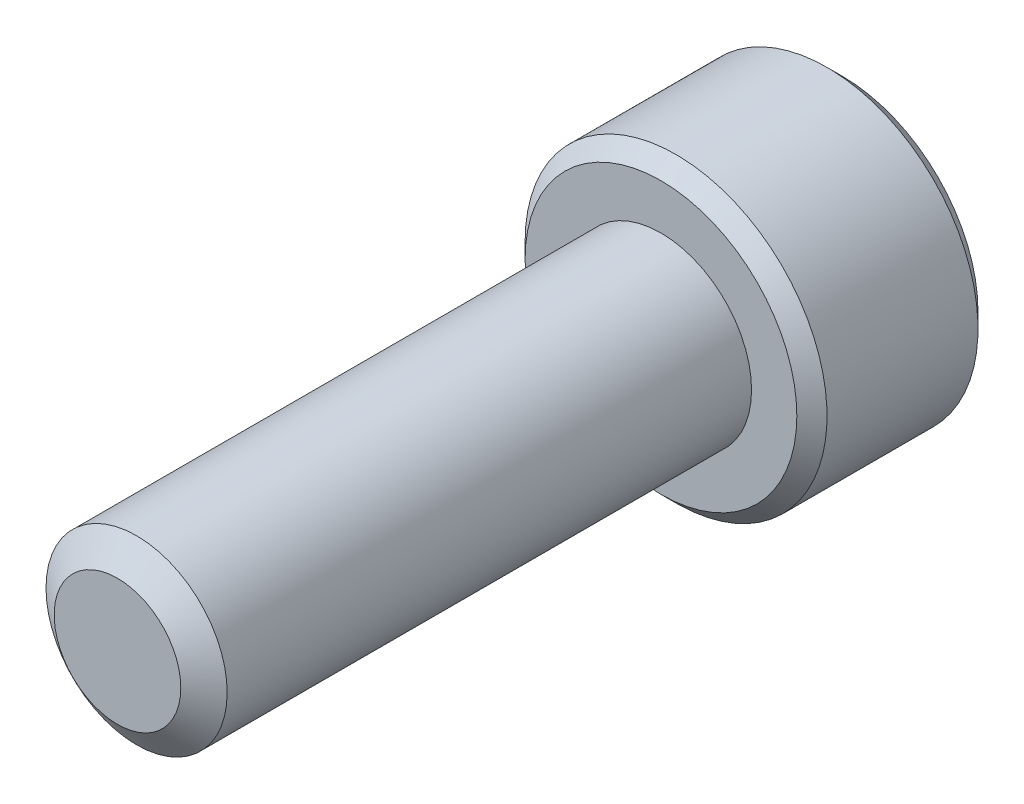
ISO-10303-21;
HEADER;
FILE_DESCRIPTION(('STEP AP214'),'2;1');
FILE_NAME('part.step','',(''),(''),'','','');
FILE_SCHEMA(('AUTOMOTIVE_DESIGN { 1 0 10303 214 1 1 1 1 }'));
ENDSEC;
DATA;
#1=APPLICATION_CONTEXT('core data for automotive mechanical design processes');
#2=APPLICATION_PROTOCOL_DEFINITION('international standard','automotive_design',2000,#1);
#3=PRODUCT_CONTEXT('',#1,'mechanical');
#4=PRODUCT('Part','Part','',(#3));
#5=PRODUCT_RELATED_PRODUCT_CATEGORY('part','',(#4));
#6=PRODUCT_DEFINITION_FORMATION('','',#4);
#7=PRODUCT_DEFINITION_CONTEXT('part definition',#1,'design');
#8=PRODUCT_DEFINITION('design','',#6,#7);
#9=PRODUCT_DEFINITION_SHAPE('','',#8);
#10=(LENGTH_UNIT() NAMED_UNIT(*) SI_UNIT(.MILLI.,.METRE.));
#11=(NAMED_UNIT(*) PLANE_ANGLE_UNIT() SI_UNIT($,.RADIAN.));
#12=(NAMED_UNIT(*) SI_UNIT($,.STERADIAN.) SOLID_ANGLE_UNIT());
#13=UNCERTAINTY_MEASURE_WITH_UNIT(LENGTH_MEASURE(1.E-05),#10,'distance_accuracy_value','');
#14=(GEOMETRIC_REPRESENTATION_CONTEXT(3) GLOBAL_UNCERTAINTY_ASSIGNED_CONTEXT((#13)) GLOBAL_UNIT_ASSIGNED_CONTEXT((#10,
#11,#12)) REPRESENTATION_CONTEXT('',''));
#15=CARTESIAN_POINT('',(0.,0.,0.));
#16=DIRECTION('',(0.,0.,1.));
#17=DIRECTION('',(1.,0.,0.));
#18=AXIS2_PLACEMENT_3D('',#15,#16,#17);
#19=CARTESIAN_POINT('',(0.,0.,-18.));
#20=DIRECTION('',(0.,0.,1.));
#21=DIRECTION('',(1.,0.,0.));
#22=AXIS2_PLACEMENT_3D('',#19,#20,#21);
#23=CYLINDRICAL_SURFACE('',#22,3.);
#24=CARTESIAN_POINT('',(0.,0.,-18.));
#25=DIRECTION('',(0.,0.,-1.));
#26=DIRECTION('',(-1.,0.,0.));
#27=AXIS2_PLACEMENT_3D('',#24,#25,#26);
#28=CIRCLE('',#27,3.);
#29=CARTESIAN_POINT('',(-3.,0.,-18.));
#30=VERTEX_POINT('',#29);
#31=EDGE_CURVE('E154',#30,#30,#28,.F.);
#32=ORIENTED_EDGE('',*,*,#31,.T.);
#33=EDGE_LOOP('',(#32));
#34=FACE_BOUND('',#33,.T.);
#35=CARTESIAN_POINT('',(0.,0.,-0.632650851713494));
#36=DIRECTION('',(0.,0.,1.));
#37=DIRECTION('',(1.,0.,0.));
#38=AXIS2_PLACEMENT_3D('',#35,#36,#37);
#39=CIRCLE('',#38,3.);
#40=CARTESIAN_POINT('',(3.,0.,-0.632650851713494));
#41=VERTEX_POINT('',#40);
#42=EDGE_CURVE('E171',#41,#41,#39,.T.);
#43=ORIENTED_EDGE('',*,*,#42,.F.);
#44=EDGE_LOOP('',(#43));
#45=FACE_BOUND('',#44,.T.);
#46=ADVANCED_FACE('F39',(#34,#45),#23,.T.);
#47=CARTESIAN_POINT('',(0.,0.,0.));
#48=DIRECTION('',(0.,0.,-1.));
#49=DIRECTION('',(-1.,0.,0.));
#50=AXIS2_PLACEMENT_3D('',#47,#48,#49);
#51=CONICAL_SURFACE('',#50,2.09648094716167,0.959931088596884);
#52=ORIENTED_EDGE('',*,*,#42,.T.);
#53=EDGE_LOOP('',(#52));
#54=FACE_BOUND('',#53,.T.);
#55=CARTESIAN_POINT('',(0.,0.,0.));
#56=DIRECTION('',(0.,0.,1.));
#57=DIRECTION('',(1.,0.,0.));
#58=AXIS2_PLACEMENT_3D('',#55,#56,#57);
#59=CIRCLE('',#58,2.09648094716167);
#60=CARTESIAN_POINT('',(2.09648094716167,0.,0.));
#61=VERTEX_POINT('',#60);
#62=EDGE_CURVE('E167',#61,#61,#59,.T.);
#63=ORIENTED_EDGE('',*,*,#62,.F.);
#64=EDGE_LOOP('',(#63));
#65=FACE_BOUND('',#64,.T.);
#66=ADVANCED_FACE('F220',(#54,#65),#51,.T.);
#67=CARTESIAN_POINT('',(0.,0.,0.));
#68=DIRECTION('',(0.,0.,1.));
#69=DIRECTION('',(1.,0.,0.));
#70=AXIS2_PLACEMENT_3D('',#67,#68,#69);
#71=PLANE('',#70);
#72=ORIENTED_EDGE('',*,*,#62,.T.);
#73=EDGE_LOOP('',(#72));
#74=FACE_BOUND('',#73,.T.);
#75=ADVANCED_FACE('F226',(#74),#71,.T.);
#76=CARTESIAN_POINT('',(0.,0.,-24.));
#77=DIRECTION('',(0.,0.,1.));
#78=DIRECTION('',(1.,0.,0.));
#79=AXIS2_PLACEMENT_3D('',#76,#77,#78);
#80=CYLINDRICAL_SURFACE('',#79,5.);
#81=CARTESIAN_POINT('',(0.,0.,-23.5));
#82=DIRECTION('',(0.,0.,-1.));
#83=DIRECTION('',(-1.,0.,0.));
#84=AXIS2_PLACEMENT_3D('',#81,#82,#83);
#85=CIRCLE('',#84,5.);
#86=CARTESIAN_POINT('',(-5.,0.,-23.5));
#87=VERTEX_POINT('',#86);
#88=EDGE_CURVE('E48',#87,#87,#85,.F.);
#89=ORIENTED_EDGE('',*,*,#88,.T.);
#90=EDGE_LOOP('',(#89));
#91=FACE_BOUND('',#90,.T.);
#92=CARTESIAN_POINT('',(0.,0.,-18.5));
#93=DIRECTION('',(0.,0.,-1.));
#94=DIRECTION('',(-1.,0.,0.));
#95=AXIS2_PLACEMENT_3D('',#92,#93,#94);
#96=CIRCLE('',#95,5.);
#97=CARTESIAN_POINT('',(-5.,0.,-18.5));
#98=VERTEX_POINT('',#97);
#99=EDGE_CURVE('E179',#98,#98,#96,.T.);
#100=ORIENTED_EDGE('',*,*,#99,.T.);
#101=EDGE_LOOP('',(#100));
#102=FACE_BOUND('',#101,.T.);
#103=ADVANCED_FACE('F186',(#91,#102),#80,.T.);
#104=CARTESIAN_POINT('',(0.,0.,-24.));
#105=DIRECTION('',(0.,0.,-1.));
#106=DIRECTION('',(-1.,0.,0.));
#107=AXIS2_PLACEMENT_3D('',#104,#105,#106);
#108=PLANE('',#107);
#109=CARTESIAN_POINT('',(0.,0.,-24.));
#110=DIRECTION('',(0.,0.,-1.));
#111=DIRECTION('',(-1.,0.,0.));
#112=AXIS2_PLACEMENT_3D('',#109,#110,#111);
#113=CIRCLE('',#112,4.5);
#114=CARTESIAN_POINT('',(-4.5,0.,-24.));
#115=VERTEX_POINT('',#114);
#116=EDGE_CURVE('E175',#115,#115,#113,.T.);
#117=ORIENTED_EDGE('',*,*,#116,.T.);
#118=EDGE_LOOP('',(#117));
#119=FACE_BOUND('',#118,.T.);
#120=DIRECTION('',(0.866025403784439,0.5,0.));
#121=VECTOR('',#120,1.);
#122=CARTESIAN_POINT('',(-2.5,1.44337567297406,-24.));
#123=LINE('',#122,#121);
#124=CARTESIAN_POINT('',(-2.5,1.44337567297406,-24.));
#125=VERTEX_POINT('',#124);
#126=CARTESIAN_POINT('',(0.,2.88675134594813,-24.));
#127=VERTEX_POINT('',#126);
#128=EDGE_CURVE('E55',#125,#127,#123,.T.);
#129=ORIENTED_EDGE('',*,*,#128,.F.);
#130=DIRECTION('',(0.,1.,0.));
#131=VECTOR('',#130,1.);
#132=CARTESIAN_POINT('',(-2.5,-1.44337567297406,-24.));
#133=LINE('',#132,#131);
#134=CARTESIAN_POINT('',(-2.5,-1.44337567297406,-24.));
#135=VERTEX_POINT('',#134);
#136=EDGE_CURVE('E148',#135,#125,#133,.T.);
#137=ORIENTED_EDGE('',*,*,#136,.F.);
#138=DIRECTION('',(-0.866025403784439,0.5,0.));
#139=VECTOR('',#138,1.);
#140=CARTESIAN_POINT('',(0.,-2.88675134594813,-24.));
#141=LINE('',#140,#139);
#142=CARTESIAN_POINT('',(0.,-2.88675134594813,-24.));
#143=VERTEX_POINT('',#142);
#144=EDGE_CURVE('E145',#143,#135,#141,.T.);
#145=ORIENTED_EDGE('',*,*,#144,.F.);
#146=DIRECTION('',(-0.866025403784439,-0.5,0.));
#147=VECTOR('',#146,1.);
#148=CARTESIAN_POINT('',(2.5,-1.44337567297407,-24.));
#149=LINE('',#148,#147);
#150=CARTESIAN_POINT('',(2.5,-1.44337567297407,-24.));
#151=VERTEX_POINT('',#150);
#152=EDGE_CURVE('E103',#151,#143,#149,.T.);
#153=ORIENTED_EDGE('',*,*,#152,.F.);
#154=DIRECTION('',(0.,-1.,0.));
#155=VECTOR('',#154,1.);
#156=CARTESIAN_POINT('',(2.5,1.44337567297406,-24.));
#157=LINE('',#156,#155);
#158=CARTESIAN_POINT('',(2.5,1.44337567297406,-24.));
#159=VERTEX_POINT('',#158);
#160=EDGE_CURVE('E139',#159,#151,#157,.T.);
#161=ORIENTED_EDGE('',*,*,#160,.F.);
#162=DIRECTION('',(0.866025403784439,-0.5,0.));
#163=VECTOR('',#162,1.);
#164=CARTESIAN_POINT('',(0.,2.88675134594813,-24.));
#165=LINE('',#164,#163);
#166=EDGE_CURVE('E135',#127,#159,#165,.T.);
#167=ORIENTED_EDGE('',*,*,#166,.F.);
#168=EDGE_LOOP('',(#129,#137,#145,#153,#161,#167));
#169=FACE_BOUND('',#168,.T.);
#170=ADVANCED_FACE('F194',(#119,#169),#108,.T.);
#171=CARTESIAN_POINT('',(0.,0.,-18.));
#172=DIRECTION('',(0.,0.,-1.));
#173=DIRECTION('',(-1.,0.,0.));
#174=AXIS2_PLACEMENT_3D('',#171,#172,#173);
#175=PLANE('',#174);
#176=CARTESIAN_POINT('',(0.,0.,-18.));
#177=DIRECTION('',(0.,0.,-1.));
#178=DIRECTION('',(-1.,0.,0.));
#179=AXIS2_PLACEMENT_3D('',#176,#177,#178);
#180=CIRCLE('',#179,4.5);
#181=CARTESIAN_POINT('',(-4.5,0.,-18.));
#182=VERTEX_POINT('',#181);
#183=EDGE_CURVE('E11',#182,#182,#180,.F.);
#184=ORIENTED_EDGE('',*,*,#183,.T.);
#185=EDGE_LOOP('',(#184));
#186=FACE_BOUND('',#185,.T.);
#187=ORIENTED_EDGE('',*,*,#31,.F.);
#188=EDGE_LOOP('',(#187));
#189=FACE_BOUND('',#188,.T.);
#190=ADVANCED_FACE('F197',(#186,#189),#175,.F.);
#191=CARTESIAN_POINT('',(-2.5,1.44337567297406,-20.25));
#192=DIRECTION('',(-0.5,0.866025403784439,0.));
#193=DIRECTION('',(-0.866025403784439,-0.5,0.));
#194=AXIS2_PLACEMENT_3D('',#191,#192,#193);
#195=PLANE('',#194);
#196=ORIENTED_EDGE('',*,*,#128,.T.);
#197=DIRECTION('',(0.,0.,-1.));
#198=VECTOR('',#197,1.);
#199=CARTESIAN_POINT('',(0.,2.88675134594813,-20.25));
#200=LINE('',#199,#198);
#201=CARTESIAN_POINT('',(0.,2.88675134594813,-20.25));
#202=VERTEX_POINT('',#201);
#203=EDGE_CURVE('E85',#202,#127,#200,.T.);
#204=ORIENTED_EDGE('',*,*,#203,.F.);
#205=DIRECTION('',(0.866025403784439,0.5,0.));
#206=VECTOR('',#205,1.);
#207=CARTESIAN_POINT('',(-2.5,1.44337567297406,-20.25));
#208=LINE('',#207,#206);
#209=CARTESIAN_POINT('',(-2.5,1.44337567297406,-20.25));
#210=VERTEX_POINT('',#209);
#211=EDGE_CURVE('E151',#210,#202,#208,.T.);
#212=ORIENTED_EDGE('',*,*,#211,.F.);
#213=DIRECTION('',(0.,0.,-1.));
#214=VECTOR('',#213,1.);
#215=CARTESIAN_POINT('',(-2.5,1.44337567297406,-20.25));
#216=LINE('',#215,#214);
#217=EDGE_CURVE('E63',#210,#125,#216,.T.);
#218=ORIENTED_EDGE('',*,*,#217,.T.);
#219=EDGE_LOOP('',(#196,#204,#212,#218));
#220=FACE_BOUND('',#219,.T.);
#221=ADVANCED_FACE('F207',(#220),#195,.F.);
#222=CARTESIAN_POINT('',(-2.5,-1.44337567297406,-20.25));
#223=DIRECTION('',(-1.,0.,0.));
#224=DIRECTION('',(0.,-1.,0.));
#225=AXIS2_PLACEMENT_3D('',#222,#223,#224);
#226=PLANE('',#225);
#227=ORIENTED_EDGE('',*,*,#136,.T.);
#228=ORIENTED_EDGE('',*,*,#217,.F.);
#229=DIRECTION('',(0.,1.,0.));
#230=VECTOR('',#229,1.);
#231=CARTESIAN_POINT('',(-2.5,-1.44337567297406,-20.25));
#232=LINE('',#231,#230);
#233=CARTESIAN_POINT('',(-2.5,-1.44337567297406,-20.25));
#234=VERTEX_POINT('',#233);
#235=EDGE_CURVE('E117',#234,#210,#232,.T.);
#236=ORIENTED_EDGE('',*,*,#235,.F.);
#237=DIRECTION('',(0.,0.,-1.));
#238=VECTOR('',#237,1.);
#239=CARTESIAN_POINT('',(-2.5,-1.44337567297406,-20.25));
#240=LINE('',#239,#238);
#241=EDGE_CURVE('E108',#234,#135,#240,.T.);
#242=ORIENTED_EDGE('',*,*,#241,.T.);
#243=EDGE_LOOP('',(#227,#228,#236,#242));
#244=FACE_BOUND('',#243,.T.);
#245=ADVANCED_FACE('F209',(#244),#226,.F.);
#246=CARTESIAN_POINT('',(0.,-2.88675134594813,-20.25));
#247=DIRECTION('',(-0.5,-0.866025403784439,0.));
#248=DIRECTION('',(0.866025403784439,-0.5,0.));
#249=AXIS2_PLACEMENT_3D('',#246,#247,#248);
#250=PLANE('',#249);
#251=ORIENTED_EDGE('',*,*,#144,.T.);
#252=ORIENTED_EDGE('',*,*,#241,.F.);
#253=DIRECTION('',(-0.866025403784439,0.5,0.));
#254=VECTOR('',#253,1.);
#255=CARTESIAN_POINT('',(0.,-2.88675134594813,-20.25));
#256=LINE('',#255,#254);
#257=CARTESIAN_POINT('',(0.,-2.88675134594813,-20.25));
#258=VERTEX_POINT('',#257);
#259=EDGE_CURVE('E112',#258,#234,#256,.T.);
#260=ORIENTED_EDGE('',*,*,#259,.F.);
#261=DIRECTION('',(0.,0.,-1.));
#262=VECTOR('',#261,1.);
#263=CARTESIAN_POINT('',(0.,-2.88675134594813,-20.25));
#264=LINE('',#263,#262);
#265=EDGE_CURVE('E96',#258,#143,#264,.T.);
#266=ORIENTED_EDGE('',*,*,#265,.T.);
#267=EDGE_LOOP('',(#251,#252,#260,#266));
#268=FACE_BOUND('',#267,.T.);
#269=ADVANCED_FACE('F113',(#268),#250,.F.);
#270=CARTESIAN_POINT('',(2.5,-1.44337567297407,-20.25));
#271=DIRECTION('',(0.5,-0.866025403784439,0.));
#272=DIRECTION('',(0.866025403784439,0.5,0.));
#273=AXIS2_PLACEMENT_3D('',#270,#271,#272);
#274=PLANE('',#273);
#275=ORIENTED_EDGE('',*,*,#152,.T.);
#276=ORIENTED_EDGE('',*,*,#265,.F.);
#277=DIRECTION('',(-0.866025403784439,-0.5,0.));
#278=VECTOR('',#277,1.);
#279=CARTESIAN_POINT('',(2.5,-1.44337567297407,-20.25));
#280=LINE('',#279,#278);
#281=CARTESIAN_POINT('',(2.5,-1.44337567297407,-20.25));
#282=VERTEX_POINT('',#281);
#283=EDGE_CURVE('E100',#282,#258,#280,.T.);
#284=ORIENTED_EDGE('',*,*,#283,.F.);
#285=DIRECTION('',(0.,0.,-1.));
#286=VECTOR('',#285,1.);
#287=CARTESIAN_POINT('',(2.5,-1.44337567297407,-20.25));
#288=LINE('',#287,#286);
#289=EDGE_CURVE('E109',#282,#151,#288,.T.);
#290=ORIENTED_EDGE('',*,*,#289,.T.);
#291=EDGE_LOOP('',(#275,#276,#284,#290));
#292=FACE_BOUND('',#291,.T.);
#293=ADVANCED_FACE('F98',(#292),#274,.F.);
#294=CARTESIAN_POINT('',(2.5,1.44337567297406,-20.25));
#295=DIRECTION('',(1.,0.,0.));
#296=DIRECTION('',(0.,0.,-1.));
#297=AXIS2_PLACEMENT_3D('',#294,#295,#296);
#298=PLANE('',#297);
#299=ORIENTED_EDGE('',*,*,#160,.T.);
#300=ORIENTED_EDGE('',*,*,#289,.F.);
#301=DIRECTION('',(0.,-1.,0.));
#302=VECTOR('',#301,1.);
#303=CARTESIAN_POINT('',(2.5,1.44337567297406,-20.25));
#304=LINE('',#303,#302);
#305=CARTESIAN_POINT('',(2.5,1.44337567297406,-20.25));
#306=VERTEX_POINT('',#305);
#307=EDGE_CURVE('E123',#306,#282,#304,.T.);
#308=ORIENTED_EDGE('',*,*,#307,.F.);
#309=DIRECTION('',(0.,0.,-1.));
#310=VECTOR('',#309,1.);
#311=CARTESIAN_POINT('',(2.5,1.44337567297406,-20.25));
#312=LINE('',#311,#310);
#313=EDGE_CURVE('E159',#306,#159,#312,.T.);
#314=ORIENTED_EDGE('',*,*,#313,.T.);
#315=EDGE_LOOP('',(#299,#300,#308,#314));
#316=FACE_BOUND('',#315,.T.);
#317=ADVANCED_FACE('F281',(#316),#298,.F.);
#318=CARTESIAN_POINT('',(0.,2.88675134594813,-20.25));
#319=DIRECTION('',(0.5,0.866025403784439,0.));
#320=DIRECTION('',(-0.866025403784439,0.5,0.));
#321=AXIS2_PLACEMENT_3D('',#318,#319,#320);
#322=PLANE('',#321);
#323=ORIENTED_EDGE('',*,*,#166,.T.);
#324=ORIENTED_EDGE('',*,*,#313,.F.);
#325=DIRECTION('',(0.866025403784439,-0.5,0.));
#326=VECTOR('',#325,1.);
#327=CARTESIAN_POINT('',(0.,2.88675134594813,-20.25));
#328=LINE('',#327,#326);
#329=EDGE_CURVE('E127',#202,#306,#328,.T.);
#330=ORIENTED_EDGE('',*,*,#329,.F.);
#331=ORIENTED_EDGE('',*,*,#203,.T.);
#332=EDGE_LOOP('',(#323,#324,#330,#331));
#333=FACE_BOUND('',#332,.T.);
#334=ADVANCED_FACE('F203',(#333),#322,.F.);
#335=CARTESIAN_POINT('',(2.5,4.33012701892219,-20.25));
#336=DIRECTION('',(0.,0.,-1.));
#337=DIRECTION('',(-1.,0.,0.));
#338=AXIS2_PLACEMENT_3D('',#335,#336,#337);
#339=PLANE('',#338);
#340=ORIENTED_EDGE('',*,*,#211,.T.);
#341=ORIENTED_EDGE('',*,*,#329,.T.);
#342=ORIENTED_EDGE('',*,*,#307,.T.);
#343=ORIENTED_EDGE('',*,*,#283,.T.);
#344=ORIENTED_EDGE('',*,*,#259,.T.);
#345=ORIENTED_EDGE('',*,*,#235,.T.);
#346=EDGE_LOOP('',(#340,#341,#342,#343,#344,#345));
#347=FACE_BOUND('',#346,.T.);
#348=ADVANCED_FACE('F120',(#347),#339,.T.);
#349=CARTESIAN_POINT('',(0.,0.,-24.));
#350=DIRECTION('',(0.,0.,1.));
#351=DIRECTION('',(1.,0.,0.));
#352=AXIS2_PLACEMENT_3D('',#349,#350,#351);
#353=CONICAL_SURFACE('',#352,4.5,0.785398163397444);
#354=ORIENTED_EDGE('',*,*,#88,.F.);
#355=EDGE_LOOP('',(#354));
#356=FACE_BOUND('',#355,.T.);
#357=ORIENTED_EDGE('',*,*,#116,.F.);
#358=EDGE_LOOP('',(#357));
#359=FACE_BOUND('',#358,.T.);
#360=ADVANCED_FACE('F189',(#356,#359),#353,.T.);
#361=CARTESIAN_POINT('',(0.,0.,-18.5));
#362=DIRECTION('',(0.,0.,-1.));
#363=DIRECTION('',(-1.,0.,0.));
#364=AXIS2_PLACEMENT_3D('',#361,#362,#363);
#365=CONICAL_SURFACE('',#364,5.,0.785398163397454);
#366=ORIENTED_EDGE('',*,*,#183,.F.);
#367=EDGE_LOOP('',(#366));
#368=FACE_BOUND('',#367,.T.);
#369=ORIENTED_EDGE('',*,*,#99,.F.);
#370=EDGE_LOOP('',(#369));
#371=FACE_BOUND('',#370,.T.);
#372=ADVANCED_FACE('F41',(#368,#371),#365,.T.);
#373=CLOSED_SHELL('',(#46,#66,#75,#103,#170,#190,#221,#245,#269,#293,#317,#334,#348,#360,#372));
#374=MANIFOLD_SOLID_BREP('B2',#373);
#375=ADVANCED_BREP_SHAPE_REPRESENTATION('',(#18,#374),#14);
#376=SHAPE_DEFINITION_REPRESENTATION(#9,#375);
ENDSEC;
END-ISO-10303-21;
